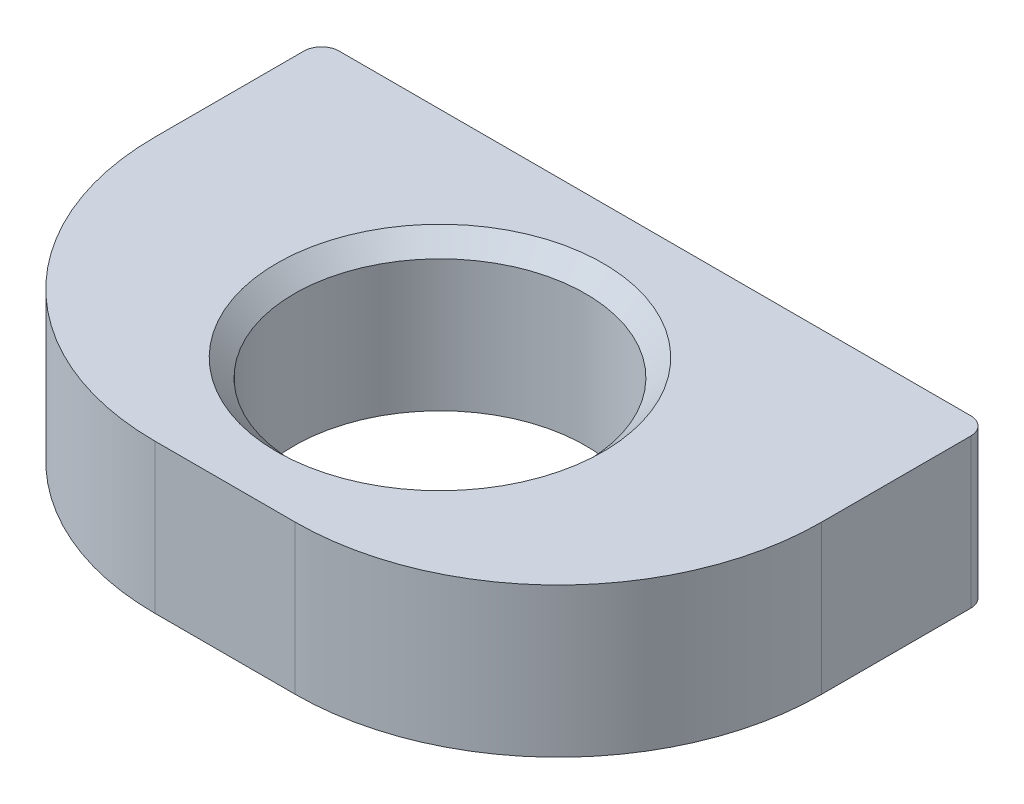
ISO-10303-21;
HEADER;
FILE_DESCRIPTION(('STEP AP214'),'2;1');
FILE_NAME('part.step','',(''),(''),'','','');
FILE_SCHEMA(('AUTOMOTIVE_DESIGN { 1 0 10303 214 1 1 1 1 }'));
ENDSEC;
DATA;
#1=APPLICATION_CONTEXT('core data for automotive mechanical design processes');
#2=APPLICATION_PROTOCOL_DEFINITION('international standard','automotive_design',2000,#1);
#3=PRODUCT_CONTEXT('',#1,'mechanical');
#4=PRODUCT('Part','Part','',(#3));
#5=PRODUCT_RELATED_PRODUCT_CATEGORY('part','',(#4));
#6=PRODUCT_DEFINITION_FORMATION('','',#4);
#7=PRODUCT_DEFINITION_CONTEXT('part definition',#1,'design');
#8=PRODUCT_DEFINITION('design','',#6,#7);
#9=PRODUCT_DEFINITION_SHAPE('','',#8);
#10=(LENGTH_UNIT() NAMED_UNIT(*) SI_UNIT(.MILLI.,.METRE.));
#11=(NAMED_UNIT(*) PLANE_ANGLE_UNIT() SI_UNIT($,.RADIAN.));
#12=(NAMED_UNIT(*) SI_UNIT($,.STERADIAN.) SOLID_ANGLE_UNIT());
#13=UNCERTAINTY_MEASURE_WITH_UNIT(LENGTH_MEASURE(1.E-05),#10,'distance_accuracy_value','');
#14=(GEOMETRIC_REPRESENTATION_CONTEXT(3) GLOBAL_UNCERTAINTY_ASSIGNED_CONTEXT((#13)) GLOBAL_UNIT_ASSIGNED_CONTEXT((#10,
#11,#12)) REPRESENTATION_CONTEXT('',''));
#15=CARTESIAN_POINT('',(0.,0.,0.));
#16=DIRECTION('',(0.,0.,1.));
#17=DIRECTION('',(1.,0.,0.));
#18=AXIS2_PLACEMENT_3D('',#15,#16,#17);
#19=CARTESIAN_POINT('',(0.,8.5,0.));
#20=DIRECTION('',(0.,1.,0.));
#21=DIRECTION('',(0.,0.,1.));
#22=AXIS2_PLACEMENT_3D('',#19,#20,#21);
#23=PLANE('',#22);
#24=CARTESIAN_POINT('',(0.,8.5,0.));
#25=DIRECTION('',(0.,1.,0.));
#26=DIRECTION('',(0.,0.,1.));
#27=AXIS2_PLACEMENT_3D('',#24,#25,#26);
#28=CIRCLE('',#27,9.30000000000001);
#29=CARTESIAN_POINT('',(0.,8.5,9.30000000000001));
#30=VERTEX_POINT('',#29);
#31=EDGE_CURVE('E11',#30,#30,#28,.F.);
#32=ORIENTED_EDGE('',*,*,#31,.T.);
#33=EDGE_LOOP('',(#32));
#34=FACE_BOUND('',#33,.T.);
#35=DIRECTION('',(-1.,0.,0.));
#36=VECTOR('',#35,1.);
#37=CARTESIAN_POINT('',(-19.,8.5,-12.25));
#38=LINE('',#37,#36);
#39=CARTESIAN_POINT('',(18.,8.5,-12.25));
#40=VERTEX_POINT('',#39);
#41=CARTESIAN_POINT('',(-18.,8.5,-12.25));
#42=VERTEX_POINT('',#41);
#43=EDGE_CURVE('E125',#40,#42,#38,.T.);
#44=ORIENTED_EDGE('',*,*,#43,.T.);
#45=CARTESIAN_POINT('',(-18.,8.5,-11.25));
#46=DIRECTION('',(0.,1.,0.));
#47=DIRECTION('',(0.,0.,1.));
#48=AXIS2_PLACEMENT_3D('',#45,#46,#47);
#49=CIRCLE('',#48,1.);
#50=CARTESIAN_POINT('',(-19.,8.5,-11.25));
#51=VERTEX_POINT('',#50);
#52=EDGE_CURVE('E165',#42,#51,#49,.T.);
#53=ORIENTED_EDGE('',*,*,#52,.T.);
#54=DIRECTION('',(0.,0.,1.));
#55=VECTOR('',#54,1.);
#56=CARTESIAN_POINT('',(-19.,8.5,-12.25));
#57=LINE('',#56,#55);
#58=CARTESIAN_POINT('',(-19.,8.5,-2.75));
#59=VERTEX_POINT('',#58);
#60=EDGE_CURVE('E135',#51,#59,#57,.T.);
#61=ORIENTED_EDGE('',*,*,#60,.T.);
#62=CARTESIAN_POINT('',(-4.,8.5,-2.75));
#63=DIRECTION('',(0.,1.,0.));
#64=DIRECTION('',(0.,0.,1.));
#65=AXIS2_PLACEMENT_3D('',#62,#63,#64);
#66=CIRCLE('',#65,15.);
#67=CARTESIAN_POINT('',(-4.,8.5,12.25));
#68=VERTEX_POINT('',#67);
#69=EDGE_CURVE('E146',#59,#68,#66,.T.);
#70=ORIENTED_EDGE('',*,*,#69,.T.);
#71=DIRECTION('',(1.,0.,0.));
#72=VECTOR('',#71,1.);
#73=CARTESIAN_POINT('',(-19.,8.5,12.25));
#74=LINE('',#73,#72);
#75=CARTESIAN_POINT('',(4.,8.5,12.25));
#76=VERTEX_POINT('',#75);
#77=EDGE_CURVE('E220',#68,#76,#74,.T.);
#78=ORIENTED_EDGE('',*,*,#77,.T.);
#79=CARTESIAN_POINT('',(4.,8.5,-2.75));
#80=DIRECTION('',(0.,1.,0.));
#81=DIRECTION('',(0.,0.,1.));
#82=AXIS2_PLACEMENT_3D('',#79,#80,#81);
#83=CIRCLE('',#82,15.);
#84=CARTESIAN_POINT('',(19.,8.5,-2.75));
#85=VERTEX_POINT('',#84);
#86=EDGE_CURVE('E148',#76,#85,#83,.T.);
#87=ORIENTED_EDGE('',*,*,#86,.T.);
#88=DIRECTION('',(0.,0.,-1.));
#89=VECTOR('',#88,1.);
#90=CARTESIAN_POINT('',(19.,8.5,-12.25));
#91=LINE('',#90,#89);
#92=CARTESIAN_POINT('',(19.,8.5,-11.25));
#93=VERTEX_POINT('',#92);
#94=EDGE_CURVE('E124',#85,#93,#91,.T.);
#95=ORIENTED_EDGE('',*,*,#94,.T.);
#96=CARTESIAN_POINT('',(18.,8.5,-11.25));
#97=DIRECTION('',(0.,1.,0.));
#98=DIRECTION('',(0.,0.,1.));
#99=AXIS2_PLACEMENT_3D('',#96,#97,#98);
#100=CIRCLE('',#99,1.);
#101=EDGE_CURVE('E163',#93,#40,#100,.T.);
#102=ORIENTED_EDGE('',*,*,#101,.T.);
#103=EDGE_LOOP('',(#44,#53,#61,#70,#78,#87,#95,#102));
#104=FACE_BOUND('',#103,.T.);
#105=ADVANCED_FACE('F39',(#34,#104),#23,.T.);
#106=CARTESIAN_POINT('',(0.,0.,0.));
#107=DIRECTION('',(0.,1.,0.));
#108=DIRECTION('',(0.,0.,1.));
#109=AXIS2_PLACEMENT_3D('',#106,#107,#108);
#110=PLANE('',#109);
#111=DIRECTION('',(0.,0.,1.));
#112=VECTOR('',#111,1.);
#113=CARTESIAN_POINT('',(-19.,0.,-12.25));
#114=LINE('',#113,#112);
#115=CARTESIAN_POINT('',(-19.,0.,-11.25));
#116=VERTEX_POINT('',#115);
#117=CARTESIAN_POINT('',(-19.,0.,-2.75));
#118=VERTEX_POINT('',#117);
#119=EDGE_CURVE('E137',#116,#118,#114,.T.);
#120=ORIENTED_EDGE('',*,*,#119,.F.);
#121=CARTESIAN_POINT('',(-18.,0.,-11.25));
#122=DIRECTION('',(0.,1.,0.));
#123=DIRECTION('',(0.,0.,1.));
#124=AXIS2_PLACEMENT_3D('',#121,#122,#123);
#125=CIRCLE('',#124,1.);
#126=CARTESIAN_POINT('',(-18.,0.,-12.25));
#127=VERTEX_POINT('',#126);
#128=EDGE_CURVE('E157',#116,#127,#125,.F.);
#129=ORIENTED_EDGE('',*,*,#128,.T.);
#130=DIRECTION('',(-1.,0.,0.));
#131=VECTOR('',#130,1.);
#132=CARTESIAN_POINT('',(-19.,0.,-12.25));
#133=LINE('',#132,#131);
#134=CARTESIAN_POINT('',(18.,0.,-12.25));
#135=VERTEX_POINT('',#134);
#136=EDGE_CURVE('E132',#135,#127,#133,.T.);
#137=ORIENTED_EDGE('',*,*,#136,.F.);
#138=CARTESIAN_POINT('',(18.,0.,-11.25));
#139=DIRECTION('',(0.,1.,0.));
#140=DIRECTION('',(0.,0.,1.));
#141=AXIS2_PLACEMENT_3D('',#138,#139,#140);
#142=CIRCLE('',#141,1.);
#143=CARTESIAN_POINT('',(19.,0.,-11.25));
#144=VERTEX_POINT('',#143);
#145=EDGE_CURVE('E131',#135,#144,#142,.F.);
#146=ORIENTED_EDGE('',*,*,#145,.T.);
#147=DIRECTION('',(0.,0.,-1.));
#148=VECTOR('',#147,1.);
#149=CARTESIAN_POINT('',(19.,0.,-12.25));
#150=LINE('',#149,#148);
#151=CARTESIAN_POINT('',(19.,0.,-2.75));
#152=VERTEX_POINT('',#151);
#153=EDGE_CURVE('E123',#152,#144,#150,.T.);
#154=ORIENTED_EDGE('',*,*,#153,.F.);
#155=CARTESIAN_POINT('',(4.,0.,-2.75));
#156=DIRECTION('',(0.,1.,0.));
#157=DIRECTION('',(0.,0.,1.));
#158=AXIS2_PLACEMENT_3D('',#155,#156,#157);
#159=CIRCLE('',#158,15.);
#160=CARTESIAN_POINT('',(4.,0.,12.25));
#161=VERTEX_POINT('',#160);
#162=EDGE_CURVE('E109',#152,#161,#159,.F.);
#163=ORIENTED_EDGE('',*,*,#162,.T.);
#164=DIRECTION('',(1.,0.,0.));
#165=VECTOR('',#164,1.);
#166=CARTESIAN_POINT('',(-19.,0.,12.25));
#167=LINE('',#166,#165);
#168=CARTESIAN_POINT('',(-4.,0.,12.25));
#169=VERTEX_POINT('',#168);
#170=EDGE_CURVE('E133',#169,#161,#167,.T.);
#171=ORIENTED_EDGE('',*,*,#170,.F.);
#172=CARTESIAN_POINT('',(-4.,0.,-2.75));
#173=DIRECTION('',(0.,1.,0.));
#174=DIRECTION('',(0.,0.,1.));
#175=AXIS2_PLACEMENT_3D('',#172,#173,#174);
#176=CIRCLE('',#175,15.);
#177=EDGE_CURVE('E120',#169,#118,#176,.F.);
#178=ORIENTED_EDGE('',*,*,#177,.T.);
#179=EDGE_LOOP('',(#120,#129,#137,#146,#154,#163,#171,#178));
#180=FACE_BOUND('',#179,.T.);
#181=CARTESIAN_POINT('',(0.,0.,0.));
#182=DIRECTION('',(0.,1.,0.));
#183=DIRECTION('',(0.,0.,1.));
#184=AXIS2_PLACEMENT_3D('',#181,#182,#183);
#185=CIRCLE('',#184,8.3);
#186=CARTESIAN_POINT('',(0.,0.,8.3));
#187=VERTEX_POINT('',#186);
#188=EDGE_CURVE('E225',#187,#187,#185,.T.);
#189=ORIENTED_EDGE('',*,*,#188,.T.);
#190=EDGE_LOOP('',(#189));
#191=FACE_BOUND('',#190,.T.);
#192=ADVANCED_FACE('F128',(#180,#191),#110,.F.);
#193=CARTESIAN_POINT('',(-19.,8.5,-12.25));
#194=DIRECTION('',(1.,0.,0.));
#195=DIRECTION('',(0.,0.,-1.));
#196=AXIS2_PLACEMENT_3D('',#193,#194,#195);
#197=PLANE('',#196);
#198=ORIENTED_EDGE('',*,*,#60,.F.);
#199=DIRECTION('',(0.,-1.,0.));
#200=VECTOR('',#199,1.);
#201=CARTESIAN_POINT('',(-19.,8.5,-11.25));
#202=LINE('',#201,#200);
#203=EDGE_CURVE('E153',#51,#116,#202,.T.);
#204=ORIENTED_EDGE('',*,*,#203,.T.);
#205=ORIENTED_EDGE('',*,*,#119,.T.);
#206=DIRECTION('',(0.,-1.,0.));
#207=VECTOR('',#206,1.);
#208=CARTESIAN_POINT('',(-19.,8.5,-2.75));
#209=LINE('',#208,#207);
#210=EDGE_CURVE('E150',#118,#59,#209,.F.);
#211=ORIENTED_EDGE('',*,*,#210,.T.);
#212=EDGE_LOOP('',(#198,#204,#205,#211));
#213=FACE_BOUND('',#212,.T.);
#214=ADVANCED_FACE('F188',(#213),#197,.F.);
#215=CARTESIAN_POINT('',(-19.,8.5,12.25));
#216=DIRECTION('',(0.,0.,-1.));
#217=DIRECTION('',(-1.,0.,0.));
#218=AXIS2_PLACEMENT_3D('',#215,#216,#217);
#219=PLANE('',#218);
#220=ORIENTED_EDGE('',*,*,#170,.T.);
#221=DIRECTION('',(0.,-1.,0.));
#222=VECTOR('',#221,1.);
#223=CARTESIAN_POINT('',(4.,8.5,12.25));
#224=LINE('',#223,#222);
#225=EDGE_CURVE('E114',#161,#76,#224,.F.);
#226=ORIENTED_EDGE('',*,*,#225,.T.);
#227=ORIENTED_EDGE('',*,*,#77,.F.);
#228=DIRECTION('',(0.,-1.,0.));
#229=VECTOR('',#228,1.);
#230=CARTESIAN_POINT('',(-4.,8.5,12.25));
#231=LINE('',#230,#229);
#232=EDGE_CURVE('E119',#68,#169,#231,.T.);
#233=ORIENTED_EDGE('',*,*,#232,.T.);
#234=EDGE_LOOP('',(#220,#226,#227,#233));
#235=FACE_BOUND('',#234,.T.);
#236=ADVANCED_FACE('F198',(#235),#219,.F.);
#237=CARTESIAN_POINT('',(19.,8.5,-12.25));
#238=DIRECTION('',(-1.,0.,0.));
#239=DIRECTION('',(0.,0.,1.));
#240=AXIS2_PLACEMENT_3D('',#237,#238,#239);
#241=PLANE('',#240);
#242=ORIENTED_EDGE('',*,*,#153,.T.);
#243=DIRECTION('',(0.,-1.,0.));
#244=VECTOR('',#243,1.);
#245=CARTESIAN_POINT('',(19.,8.5,-11.25));
#246=LINE('',#245,#244);
#247=EDGE_CURVE('E55',#144,#93,#246,.F.);
#248=ORIENTED_EDGE('',*,*,#247,.T.);
#249=ORIENTED_EDGE('',*,*,#94,.F.);
#250=DIRECTION('',(0.,-1.,0.));
#251=VECTOR('',#250,1.);
#252=CARTESIAN_POINT('',(19.,8.5,-2.75));
#253=LINE('',#252,#251);
#254=EDGE_CURVE('E113',#85,#152,#253,.T.);
#255=ORIENTED_EDGE('',*,*,#254,.T.);
#256=EDGE_LOOP('',(#242,#248,#249,#255));
#257=FACE_BOUND('',#256,.T.);
#258=ADVANCED_FACE('F122',(#257),#241,.F.);
#259=CARTESIAN_POINT('',(-19.,8.5,-12.25));
#260=DIRECTION('',(0.,0.,1.));
#261=DIRECTION('',(1.,0.,0.));
#262=AXIS2_PLACEMENT_3D('',#259,#260,#261);
#263=PLANE('',#262);
#264=ORIENTED_EDGE('',*,*,#136,.T.);
#265=DIRECTION('',(0.,-1.,0.));
#266=VECTOR('',#265,1.);
#267=CARTESIAN_POINT('',(-18.,8.5,-12.25));
#268=LINE('',#267,#266);
#269=EDGE_CURVE('E63',#127,#42,#268,.F.);
#270=ORIENTED_EDGE('',*,*,#269,.T.);
#271=ORIENTED_EDGE('',*,*,#43,.F.);
#272=DIRECTION('',(0.,-1.,0.));
#273=VECTOR('',#272,1.);
#274=CARTESIAN_POINT('',(18.,8.5,-12.25));
#275=LINE('',#274,#273);
#276=EDGE_CURVE('E159',#40,#135,#275,.T.);
#277=ORIENTED_EDGE('',*,*,#276,.T.);
#278=EDGE_LOOP('',(#264,#270,#271,#277));
#279=FACE_BOUND('',#278,.T.);
#280=ADVANCED_FACE('F193',(#279),#263,.F.);
#281=CARTESIAN_POINT('',(0.,8.5,0.));
#282=DIRECTION('',(0.,-1.,0.));
#283=DIRECTION('',(0.,0.,-1.));
#284=AXIS2_PLACEMENT_3D('',#281,#282,#283);
#285=CYLINDRICAL_SURFACE('',#284,8.3);
#286=CARTESIAN_POINT('',(0.,7.5,0.));
#287=DIRECTION('',(0.,1.,0.));
#288=DIRECTION('',(0.,0.,1.));
#289=AXIS2_PLACEMENT_3D('',#286,#287,#288);
#290=CIRCLE('',#289,8.3);
#291=CARTESIAN_POINT('',(0.,7.5,8.3));
#292=VERTEX_POINT('',#291);
#293=EDGE_CURVE('E48',#292,#292,#290,.T.);
#294=ORIENTED_EDGE('',*,*,#293,.T.);
#295=EDGE_LOOP('',(#294));
#296=FACE_BOUND('',#295,.T.);
#297=ORIENTED_EDGE('',*,*,#188,.F.);
#298=EDGE_LOOP('',(#297));
#299=FACE_BOUND('',#298,.T.);
#300=ADVANCED_FACE('F170',(#296,#299),#285,.F.);
#301=CARTESIAN_POINT('',(4.,8.5,-2.75));
#302=DIRECTION('',(0.,-1.,0.));
#303=DIRECTION('',(0.,0.,-1.));
#304=AXIS2_PLACEMENT_3D('',#301,#302,#303);
#305=CYLINDRICAL_SURFACE('',#304,15.);
#306=ORIENTED_EDGE('',*,*,#86,.F.);
#307=ORIENTED_EDGE('',*,*,#225,.F.);
#308=ORIENTED_EDGE('',*,*,#162,.F.);
#309=ORIENTED_EDGE('',*,*,#254,.F.);
#310=EDGE_LOOP('',(#306,#307,#308,#309));
#311=FACE_BOUND('',#310,.T.);
#312=ADVANCED_FACE('F112',(#311),#305,.T.);
#313=CARTESIAN_POINT('',(-4.,8.5,-2.75));
#314=DIRECTION('',(0.,-1.,0.));
#315=DIRECTION('',(0.,0.,-1.));
#316=AXIS2_PLACEMENT_3D('',#313,#314,#315);
#317=CYLINDRICAL_SURFACE('',#316,15.);
#318=ORIENTED_EDGE('',*,*,#69,.F.);
#319=ORIENTED_EDGE('',*,*,#210,.F.);
#320=ORIENTED_EDGE('',*,*,#177,.F.);
#321=ORIENTED_EDGE('',*,*,#232,.F.);
#322=EDGE_LOOP('',(#318,#319,#320,#321));
#323=FACE_BOUND('',#322,.T.);
#324=ADVANCED_FACE('F207',(#323),#317,.T.);
#325=CARTESIAN_POINT('',(-18.,8.5,-11.25));
#326=DIRECTION('',(0.,-1.,0.));
#327=DIRECTION('',(0.,0.,-1.));
#328=AXIS2_PLACEMENT_3D('',#325,#326,#327);
#329=CYLINDRICAL_SURFACE('',#328,1.);
#330=ORIENTED_EDGE('',*,*,#52,.F.);
#331=ORIENTED_EDGE('',*,*,#269,.F.);
#332=ORIENTED_EDGE('',*,*,#128,.F.);
#333=ORIENTED_EDGE('',*,*,#203,.F.);
#334=EDGE_LOOP('',(#330,#331,#332,#333));
#335=FACE_BOUND('',#334,.T.);
#336=ADVANCED_FACE('F179',(#335),#329,.T.);
#337=CARTESIAN_POINT('',(18.,8.5,-11.25));
#338=DIRECTION('',(0.,-1.,0.));
#339=DIRECTION('',(0.,0.,-1.));
#340=AXIS2_PLACEMENT_3D('',#337,#338,#339);
#341=CYLINDRICAL_SURFACE('',#340,1.);
#342=ORIENTED_EDGE('',*,*,#101,.F.);
#343=ORIENTED_EDGE('',*,*,#247,.F.);
#344=ORIENTED_EDGE('',*,*,#145,.F.);
#345=ORIENTED_EDGE('',*,*,#276,.F.);
#346=EDGE_LOOP('',(#342,#343,#344,#345));
#347=FACE_BOUND('',#346,.T.);
#348=ADVANCED_FACE('F174',(#347),#341,.T.);
#349=CARTESIAN_POINT('',(0.,7.5,0.));
#350=DIRECTION('',(0.,1.,0.));
#351=DIRECTION('',(0.,0.,1.));
#352=AXIS2_PLACEMENT_3D('',#349,#350,#351);
#353=CONICAL_SURFACE('',#352,8.3,0.785398163397451);
#354=ORIENTED_EDGE('',*,*,#31,.F.);
#355=EDGE_LOOP('',(#354));
#356=FACE_BOUND('',#355,.T.);
#357=ORIENTED_EDGE('',*,*,#293,.F.);
#358=EDGE_LOOP('',(#357));
#359=FACE_BOUND('',#358,.T.);
#360=ADVANCED_FACE('F42',(#356,#359),#353,.F.);
#361=CLOSED_SHELL('',(#105,#192,#214,#236,#258,#280,#300,#312,#324,#336,#348,#360));
#362=MANIFOLD_SOLID_BREP('B2',#361);
#363=ADVANCED_BREP_SHAPE_REPRESENTATION('',(#18,#362),#14);
#364=SHAPE_DEFINITION_REPRESENTATION(#9,#363);
ENDSEC;
END-ISO-10303-21;
